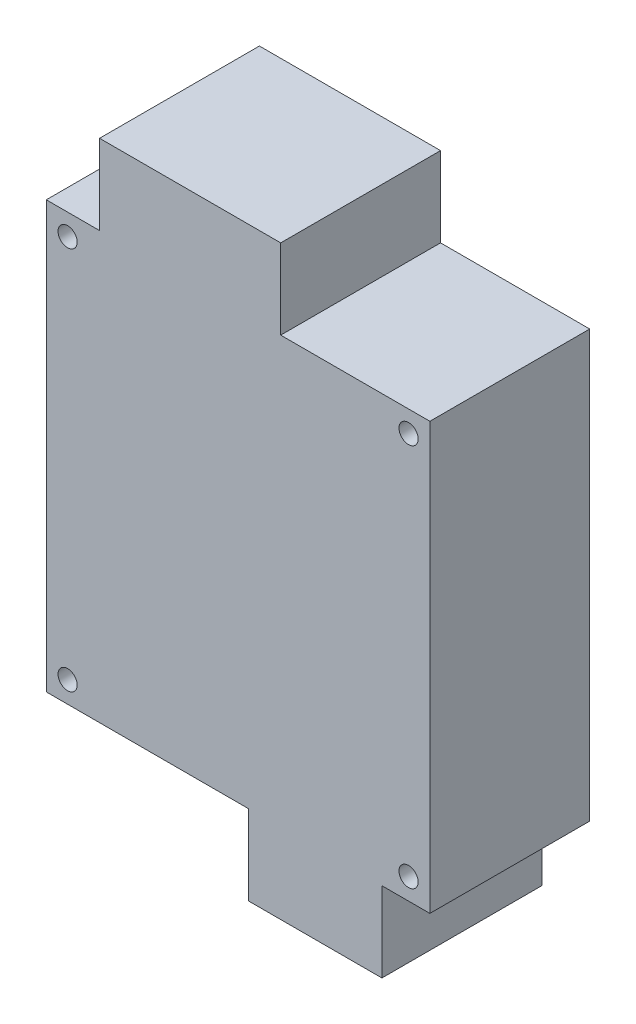
ISO-10303-21;
HEADER;
FILE_DESCRIPTION(('STEP AP214'),'2;1');
FILE_NAME('part.step','',(''),(''),'','','');
FILE_SCHEMA(('AUTOMOTIVE_DESIGN { 1 0 10303 214 1 1 1 1 }'));
ENDSEC;
DATA;
#1=APPLICATION_CONTEXT('core data for automotive mechanical design processes');
#2=APPLICATION_PROTOCOL_DEFINITION('international standard','automotive_design',2000,#1);
#3=PRODUCT_CONTEXT('',#1,'mechanical');
#4=PRODUCT('Part','Part','',(#3));
#5=PRODUCT_RELATED_PRODUCT_CATEGORY('part','',(#4));
#6=PRODUCT_DEFINITION_FORMATION('','',#4);
#7=PRODUCT_DEFINITION_CONTEXT('part definition',#1,'design');
#8=PRODUCT_DEFINITION('design','',#6,#7);
#9=PRODUCT_DEFINITION_SHAPE('','',#8);
#10=(LENGTH_UNIT() NAMED_UNIT(*) SI_UNIT(.MILLI.,.METRE.));
#11=(NAMED_UNIT(*) PLANE_ANGLE_UNIT() SI_UNIT($,.RADIAN.));
#12=(NAMED_UNIT(*) SI_UNIT($,.STERADIAN.) SOLID_ANGLE_UNIT());
#13=UNCERTAINTY_MEASURE_WITH_UNIT(LENGTH_MEASURE(1.E-05),#10,'distance_accuracy_value','');
#14=(GEOMETRIC_REPRESENTATION_CONTEXT(3) GLOBAL_UNCERTAINTY_ASSIGNED_CONTEXT((#13)) GLOBAL_UNIT_ASSIGNED_CONTEXT((#10,
#11,#12)) REPRESENTATION_CONTEXT('',''));
#15=CARTESIAN_POINT('',(0.,0.,0.));
#16=DIRECTION('',(0.,0.,1.));
#17=DIRECTION('',(1.,0.,0.));
#18=AXIS2_PLACEMENT_3D('',#15,#16,#17);
#19=CARTESIAN_POINT('',(0.,0.,30.));
#20=DIRECTION('',(1.,0.,0.));
#21=DIRECTION('',(0.,0.,-1.));
#22=AXIS2_PLACEMENT_3D('',#19,#20,#21);
#23=PLANE('',#22);
#24=DIRECTION('',(0.,-1.,0.));
#25=VECTOR('',#24,1.);
#26=CARTESIAN_POINT('',(0.,0.,0.));
#27=LINE('',#26,#25);
#28=CARTESIAN_POINT('',(0.,95.,0.));
#29=VERTEX_POINT('',#28);
#30=CARTESIAN_POINT('',(0.,15.,0.));
#31=VERTEX_POINT('',#30);
#32=EDGE_CURVE('E263',#29,#31,#27,.T.);
#33=ORIENTED_EDGE('',*,*,#32,.T.);
#34=DIRECTION('',(0.,0.,-1.));
#35=VECTOR('',#34,1.);
#36=CARTESIAN_POINT('',(0.,15.,70.853396431631));
#37=LINE('',#36,#35);
#38=CARTESIAN_POINT('',(0.,15.,30.));
#39=VERTEX_POINT('',#38);
#40=EDGE_CURVE('E197',#39,#31,#37,.T.);
#41=ORIENTED_EDGE('',*,*,#40,.F.);
#42=DIRECTION('',(0.,-1.,0.));
#43=VECTOR('',#42,1.);
#44=CARTESIAN_POINT('',(0.,0.,30.));
#45=LINE('',#44,#43);
#46=CARTESIAN_POINT('',(0.,95.,30.));
#47=VERTEX_POINT('',#46);
#48=EDGE_CURVE('E264',#47,#39,#45,.T.);
#49=ORIENTED_EDGE('',*,*,#48,.F.);
#50=DIRECTION('',(0.,0.,-1.));
#51=VECTOR('',#50,1.);
#52=CARTESIAN_POINT('',(0.,95.,70.853396431631));
#53=LINE('',#52,#51);
#54=EDGE_CURVE('E213',#47,#29,#53,.T.);
#55=ORIENTED_EDGE('',*,*,#54,.T.);
#56=EDGE_LOOP('',(#33,#41,#49,#55));
#57=FACE_BOUND('',#56,.T.);
#58=ADVANCED_FACE('F38',(#57),#23,.F.);
#59=CARTESIAN_POINT('',(0.,0.,30.));
#60=DIRECTION('',(0.,1.,0.));
#61=DIRECTION('',(0.,0.,1.));
#62=AXIS2_PLACEMENT_3D('',#59,#60,#61);
#63=PLANE('',#62);
#64=DIRECTION('',(1.,0.,0.));
#65=VECTOR('',#64,1.);
#66=CARTESIAN_POINT('',(0.,0.,0.));
#67=LINE('',#66,#65);
#68=CARTESIAN_POINT('',(38.,0.,0.));
#69=VERTEX_POINT('',#68);
#70=CARTESIAN_POINT('',(63.,0.,0.));
#71=VERTEX_POINT('',#70);
#72=EDGE_CURVE('E278',#69,#71,#67,.T.);
#73=ORIENTED_EDGE('',*,*,#72,.T.);
#74=DIRECTION('',(0.,0.,-1.));
#75=VECTOR('',#74,1.);
#76=CARTESIAN_POINT('',(63.,0.,61.7647603485372));
#77=LINE('',#76,#75);
#78=CARTESIAN_POINT('',(63.,0.,30.));
#79=VERTEX_POINT('',#78);
#80=EDGE_CURVE('E55',#79,#71,#77,.T.);
#81=ORIENTED_EDGE('',*,*,#80,.F.);
#82=DIRECTION('',(1.,0.,0.));
#83=VECTOR('',#82,1.);
#84=CARTESIAN_POINT('',(0.,0.,30.));
#85=LINE('',#84,#83);
#86=CARTESIAN_POINT('',(38.,0.,30.));
#87=VERTEX_POINT('',#86);
#88=EDGE_CURVE('E268',#87,#79,#85,.T.);
#89=ORIENTED_EDGE('',*,*,#88,.F.);
#90=DIRECTION('',(0.,0.,-1.));
#91=VECTOR('',#90,1.);
#92=CARTESIAN_POINT('',(38.,0.,70.853396431631));
#93=LINE('',#92,#91);
#94=EDGE_CURVE('E188',#87,#69,#93,.T.);
#95=ORIENTED_EDGE('',*,*,#94,.T.);
#96=EDGE_LOOP('',(#73,#81,#89,#95));
#97=FACE_BOUND('',#96,.T.);
#98=ADVANCED_FACE('F328',(#97),#63,.F.);
#99=CARTESIAN_POINT('',(72.,0.,30.));
#100=DIRECTION('',(-1.,0.,0.));
#101=DIRECTION('',(0.,0.,1.));
#102=AXIS2_PLACEMENT_3D('',#99,#100,#101);
#103=PLANE('',#102);
#104=DIRECTION('',(0.,1.,0.));
#105=VECTOR('',#104,1.);
#106=CARTESIAN_POINT('',(72.,0.,0.));
#107=LINE('',#106,#105);
#108=CARTESIAN_POINT('',(72.,15.,0.));
#109=VERTEX_POINT('',#108);
#110=CARTESIAN_POINT('',(72.,95.,0.));
#111=VERTEX_POINT('',#110);
#112=EDGE_CURVE('E281',#109,#111,#107,.T.);
#113=ORIENTED_EDGE('',*,*,#112,.T.);
#114=DIRECTION('',(0.,0.,-1.));
#115=VECTOR('',#114,1.);
#116=CARTESIAN_POINT('',(72.,95.,61.7647603485372));
#117=LINE('',#116,#115);
#118=CARTESIAN_POINT('',(72.,95.,30.));
#119=VERTEX_POINT('',#118);
#120=EDGE_CURVE('E63',#119,#111,#117,.T.);
#121=ORIENTED_EDGE('',*,*,#120,.F.);
#122=DIRECTION('',(0.,1.,0.));
#123=VECTOR('',#122,1.);
#124=CARTESIAN_POINT('',(72.,0.,30.));
#125=LINE('',#124,#123);
#126=CARTESIAN_POINT('',(72.,15.,30.));
#127=VERTEX_POINT('',#126);
#128=EDGE_CURVE('E47',#127,#119,#125,.T.);
#129=ORIENTED_EDGE('',*,*,#128,.F.);
#130=DIRECTION('',(0.,0.,-1.));
#131=VECTOR('',#130,1.);
#132=CARTESIAN_POINT('',(72.,15.,61.7647603485372));
#133=LINE('',#132,#131);
#134=EDGE_CURVE('E167',#127,#109,#133,.T.);
#135=ORIENTED_EDGE('',*,*,#134,.T.);
#136=EDGE_LOOP('',(#113,#121,#129,#135));
#137=FACE_BOUND('',#136,.T.);
#138=ADVANCED_FACE('F309',(#137),#103,.F.);
#139=CARTESIAN_POINT('',(0.,110.,30.));
#140=DIRECTION('',(0.,-1.,0.));
#141=DIRECTION('',(0.,0.,-1.));
#142=AXIS2_PLACEMENT_3D('',#139,#140,#141);
#143=PLANE('',#142);
#144=DIRECTION('',(-1.,0.,0.));
#145=VECTOR('',#144,1.);
#146=CARTESIAN_POINT('',(0.,110.,30.));
#147=LINE('',#146,#145);
#148=CARTESIAN_POINT('',(44.,110.,30.));
#149=VERTEX_POINT('',#148);
#150=CARTESIAN_POINT('',(10.,110.,30.));
#151=VERTEX_POINT('',#150);
#152=EDGE_CURVE('E11',#149,#151,#147,.T.);
#153=ORIENTED_EDGE('',*,*,#152,.F.);
#154=DIRECTION('',(0.,0.,-1.));
#155=VECTOR('',#154,1.);
#156=CARTESIAN_POINT('',(44.,110.,61.7647603485372));
#157=LINE('',#156,#155);
#158=CARTESIAN_POINT('',(44.,110.,0.));
#159=VERTEX_POINT('',#158);
#160=EDGE_CURVE('E138',#149,#159,#157,.T.);
#161=ORIENTED_EDGE('',*,*,#160,.T.);
#162=DIRECTION('',(-1.,0.,0.));
#163=VECTOR('',#162,1.);
#164=CARTESIAN_POINT('',(0.,110.,0.));
#165=LINE('',#164,#163);
#166=CARTESIAN_POINT('',(10.,110.,0.));
#167=VERTEX_POINT('',#166);
#168=EDGE_CURVE('E41',#159,#167,#165,.T.);
#169=ORIENTED_EDGE('',*,*,#168,.T.);
#170=DIRECTION('',(0.,0.,-1.));
#171=VECTOR('',#170,1.);
#172=CARTESIAN_POINT('',(10.,110.,70.853396431631));
#173=LINE('',#172,#171);
#174=EDGE_CURVE('E222',#151,#167,#173,.T.);
#175=ORIENTED_EDGE('',*,*,#174,.F.);
#176=EDGE_LOOP('',(#153,#161,#169,#175));
#177=FACE_BOUND('',#176,.T.);
#178=ADVANCED_FACE('F288',(#177),#143,.F.);
#179=CARTESIAN_POINT('',(0.,0.,30.));
#180=DIRECTION('',(0.,0.,-1.));
#181=DIRECTION('',(-1.,0.,0.));
#182=AXIS2_PLACEMENT_3D('',#179,#180,#181);
#183=PLANE('',#182);
#184=CARTESIAN_POINT('',(4.,91.,30.));
#185=DIRECTION('',(0.,0.,1.));
#186=DIRECTION('',(1.,0.,0.));
#187=AXIS2_PLACEMENT_3D('',#184,#185,#186);
#188=CIRCLE('',#187,1.8);
#189=CARTESIAN_POINT('',(5.8,91.,30.));
#190=VERTEX_POINT('',#189);
#191=EDGE_CURVE('E208',#190,#190,#188,.T.);
#192=ORIENTED_EDGE('',*,*,#191,.F.);
#193=EDGE_LOOP('',(#192));
#194=FACE_BOUND('',#193,.T.);
#195=CARTESIAN_POINT('',(68.,91.,30.));
#196=DIRECTION('',(0.,0.,1.));
#197=DIRECTION('',(1.,0.,0.));
#198=AXIS2_PLACEMENT_3D('',#195,#196,#197);
#199=CIRCLE('',#198,1.8);
#200=CARTESIAN_POINT('',(69.8,91.,30.));
#201=VERTEX_POINT('',#200);
#202=EDGE_CURVE('E239',#201,#201,#199,.T.);
#203=ORIENTED_EDGE('',*,*,#202,.F.);
#204=EDGE_LOOP('',(#203));
#205=FACE_BOUND('',#204,.T.);
#206=CARTESIAN_POINT('',(4.,19.,30.));
#207=DIRECTION('',(0.,0.,1.));
#208=DIRECTION('',(1.,0.,0.));
#209=AXIS2_PLACEMENT_3D('',#206,#207,#208);
#210=CIRCLE('',#209,1.8);
#211=CARTESIAN_POINT('',(5.8,19.,30.));
#212=VERTEX_POINT('',#211);
#213=EDGE_CURVE('E247',#212,#212,#210,.T.);
#214=ORIENTED_EDGE('',*,*,#213,.F.);
#215=EDGE_LOOP('',(#214));
#216=FACE_BOUND('',#215,.T.);
#217=CARTESIAN_POINT('',(68.,19.,30.));
#218=DIRECTION('',(0.,0.,1.));
#219=DIRECTION('',(1.,0.,0.));
#220=AXIS2_PLACEMENT_3D('',#217,#218,#219);
#221=CIRCLE('',#220,1.8);
#222=CARTESIAN_POINT('',(69.8,19.,30.));
#223=VERTEX_POINT('',#222);
#224=EDGE_CURVE('E255',#223,#223,#221,.T.);
#225=ORIENTED_EDGE('',*,*,#224,.F.);
#226=EDGE_LOOP('',(#225));
#227=FACE_BOUND('',#226,.T.);
#228=DIRECTION('',(1.,0.,0.));
#229=VECTOR('',#228,1.);
#230=CARTESIAN_POINT('',(72.,95.,30.));
#231=LINE('',#230,#229);
#232=CARTESIAN_POINT('',(44.,95.,30.));
#233=VERTEX_POINT('',#232);
#234=EDGE_CURVE('E160',#233,#119,#231,.T.);
#235=ORIENTED_EDGE('',*,*,#234,.F.);
#236=DIRECTION('',(0.,-1.,0.));
#237=VECTOR('',#236,1.);
#238=CARTESIAN_POINT('',(44.,110.,30.));
#239=LINE('',#238,#237);
#240=EDGE_CURVE('E135',#149,#233,#239,.T.);
#241=ORIENTED_EDGE('',*,*,#240,.F.);
#242=ORIENTED_EDGE('',*,*,#152,.T.);
#243=DIRECTION('',(0.,1.,0.));
#244=VECTOR('',#243,1.);
#245=CARTESIAN_POINT('',(10.,110.,30.));
#246=LINE('',#245,#244);
#247=CARTESIAN_POINT('',(10.,95.,30.));
#248=VERTEX_POINT('',#247);
#249=EDGE_CURVE('E209',#248,#151,#246,.T.);
#250=ORIENTED_EDGE('',*,*,#249,.F.);
#251=DIRECTION('',(1.,0.,0.));
#252=VECTOR('',#251,1.);
#253=CARTESIAN_POINT('',(0.,95.,30.));
#254=LINE('',#253,#252);
#255=EDGE_CURVE('E194',#47,#248,#254,.T.);
#256=ORIENTED_EDGE('',*,*,#255,.F.);
#257=ORIENTED_EDGE('',*,*,#48,.T.);
#258=DIRECTION('',(-1.,0.,0.));
#259=VECTOR('',#258,1.);
#260=CARTESIAN_POINT('',(0.,15.,30.));
#261=LINE('',#260,#259);
#262=CARTESIAN_POINT('',(38.,15.,30.));
#263=VERTEX_POINT('',#262);
#264=EDGE_CURVE('E187',#263,#39,#261,.T.);
#265=ORIENTED_EDGE('',*,*,#264,.F.);
#266=DIRECTION('',(0.,1.,0.));
#267=VECTOR('',#266,1.);
#268=CARTESIAN_POINT('',(38.,0.,30.));
#269=LINE('',#268,#267);
#270=EDGE_CURVE('E184',#87,#263,#269,.T.);
#271=ORIENTED_EDGE('',*,*,#270,.F.);
#272=ORIENTED_EDGE('',*,*,#88,.T.);
#273=DIRECTION('',(0.,-1.,0.));
#274=VECTOR('',#273,1.);
#275=CARTESIAN_POINT('',(63.,0.,30.));
#276=LINE('',#275,#274);
#277=CARTESIAN_POINT('',(63.,15.,30.));
#278=VERTEX_POINT('',#277);
#279=EDGE_CURVE('E164',#278,#79,#276,.T.);
#280=ORIENTED_EDGE('',*,*,#279,.F.);
#281=DIRECTION('',(-1.,0.,0.));
#282=VECTOR('',#281,1.);
#283=CARTESIAN_POINT('',(72.,15.,30.));
#284=LINE('',#283,#282);
#285=EDGE_CURVE('E146',#127,#278,#284,.T.);
#286=ORIENTED_EDGE('',*,*,#285,.F.);
#287=ORIENTED_EDGE('',*,*,#128,.T.);
#288=EDGE_LOOP('',(#235,#241,#242,#250,#256,#257,#265,#271,#272,#280,#286,#287));
#289=FACE_BOUND('',#288,.T.);
#290=ADVANCED_FACE('F304',(#194,#205,#216,#227,#289),#183,.F.);
#291=CARTESIAN_POINT('',(0.,0.,0.));
#292=DIRECTION('',(0.,0.,-1.));
#293=DIRECTION('',(-1.,0.,0.));
#294=AXIS2_PLACEMENT_3D('',#291,#292,#293);
#295=PLANE('',#294);
#296=DIRECTION('',(0.,1.,0.));
#297=VECTOR('',#296,1.);
#298=CARTESIAN_POINT('',(44.,110.,0.));
#299=LINE('',#298,#297);
#300=CARTESIAN_POINT('',(44.,95.,0.));
#301=VERTEX_POINT('',#300);
#302=EDGE_CURVE('E132',#301,#159,#299,.T.);
#303=ORIENTED_EDGE('',*,*,#302,.F.);
#304=DIRECTION('',(-1.,0.,0.));
#305=VECTOR('',#304,1.);
#306=CARTESIAN_POINT('',(72.,95.,0.));
#307=LINE('',#306,#305);
#308=EDGE_CURVE('E140',#111,#301,#307,.T.);
#309=ORIENTED_EDGE('',*,*,#308,.F.);
#310=ORIENTED_EDGE('',*,*,#112,.F.);
#311=DIRECTION('',(1.,0.,0.));
#312=VECTOR('',#311,1.);
#313=CARTESIAN_POINT('',(72.,15.,0.));
#314=LINE('',#313,#312);
#315=CARTESIAN_POINT('',(63.,15.,0.));
#316=VERTEX_POINT('',#315);
#317=EDGE_CURVE('E173',#316,#109,#314,.T.);
#318=ORIENTED_EDGE('',*,*,#317,.F.);
#319=DIRECTION('',(0.,1.,0.));
#320=VECTOR('',#319,1.);
#321=CARTESIAN_POINT('',(63.,0.,0.));
#322=LINE('',#321,#320);
#323=EDGE_CURVE('E170',#71,#316,#322,.T.);
#324=ORIENTED_EDGE('',*,*,#323,.F.);
#325=ORIENTED_EDGE('',*,*,#72,.F.);
#326=DIRECTION('',(0.,-1.,0.));
#327=VECTOR('',#326,1.);
#328=CARTESIAN_POINT('',(38.,0.,0.));
#329=LINE('',#328,#327);
#330=CARTESIAN_POINT('',(38.,15.,0.));
#331=VERTEX_POINT('',#330);
#332=EDGE_CURVE('E193',#331,#69,#329,.T.);
#333=ORIENTED_EDGE('',*,*,#332,.F.);
#334=DIRECTION('',(1.,0.,0.));
#335=VECTOR('',#334,1.);
#336=CARTESIAN_POINT('',(0.,15.,0.));
#337=LINE('',#336,#335);
#338=EDGE_CURVE('E189',#31,#331,#337,.T.);
#339=ORIENTED_EDGE('',*,*,#338,.F.);
#340=ORIENTED_EDGE('',*,*,#32,.F.);
#341=DIRECTION('',(-1.,0.,0.));
#342=VECTOR('',#341,1.);
#343=CARTESIAN_POINT('',(0.,95.,0.));
#344=LINE('',#343,#342);
#345=CARTESIAN_POINT('',(10.,95.,0.));
#346=VERTEX_POINT('',#345);
#347=EDGE_CURVE('E219',#346,#29,#344,.T.);
#348=ORIENTED_EDGE('',*,*,#347,.F.);
#349=DIRECTION('',(0.,-1.,0.));
#350=VECTOR('',#349,1.);
#351=CARTESIAN_POINT('',(10.,110.,0.));
#352=LINE('',#351,#350);
#353=EDGE_CURVE('E163',#167,#346,#352,.T.);
#354=ORIENTED_EDGE('',*,*,#353,.F.);
#355=ORIENTED_EDGE('',*,*,#168,.F.);
#356=EDGE_LOOP('',(#303,#309,#310,#318,#324,#325,#333,#339,#340,#348,#354,#355));
#357=FACE_BOUND('',#356,.T.);
#358=CARTESIAN_POINT('',(4.,91.,0.));
#359=DIRECTION('',(0.,0.,1.));
#360=DIRECTION('',(1.,0.,0.));
#361=AXIS2_PLACEMENT_3D('',#358,#359,#360);
#362=CIRCLE('',#361,1.8);
#363=CARTESIAN_POINT('',(5.8,91.,0.));
#364=VERTEX_POINT('',#363);
#365=EDGE_CURVE('E235',#364,#364,#362,.T.);
#366=ORIENTED_EDGE('',*,*,#365,.T.);
#367=EDGE_LOOP('',(#366));
#368=FACE_BOUND('',#367,.T.);
#369=CARTESIAN_POINT('',(68.,91.,0.));
#370=DIRECTION('',(0.,0.,1.));
#371=DIRECTION('',(1.,0.,0.));
#372=AXIS2_PLACEMENT_3D('',#369,#370,#371);
#373=CIRCLE('',#372,1.8);
#374=CARTESIAN_POINT('',(69.8,91.,0.));
#375=VERTEX_POINT('',#374);
#376=EDGE_CURVE('E243',#375,#375,#373,.T.);
#377=ORIENTED_EDGE('',*,*,#376,.T.);
#378=EDGE_LOOP('',(#377));
#379=FACE_BOUND('',#378,.T.);
#380=CARTESIAN_POINT('',(4.,19.,0.));
#381=DIRECTION('',(0.,0.,1.));
#382=DIRECTION('',(1.,0.,0.));
#383=AXIS2_PLACEMENT_3D('',#380,#381,#382);
#384=CIRCLE('',#383,1.8);
#385=CARTESIAN_POINT('',(5.8,19.,0.));
#386=VERTEX_POINT('',#385);
#387=EDGE_CURVE('E251',#386,#386,#384,.T.);
#388=ORIENTED_EDGE('',*,*,#387,.T.);
#389=EDGE_LOOP('',(#388));
#390=FACE_BOUND('',#389,.T.);
#391=CARTESIAN_POINT('',(68.,19.,0.));
#392=DIRECTION('',(0.,0.,1.));
#393=DIRECTION('',(1.,0.,0.));
#394=AXIS2_PLACEMENT_3D('',#391,#392,#393);
#395=CIRCLE('',#394,1.8);
#396=CARTESIAN_POINT('',(69.8,19.,0.));
#397=VERTEX_POINT('',#396);
#398=EDGE_CURVE('E259',#397,#397,#395,.T.);
#399=ORIENTED_EDGE('',*,*,#398,.T.);
#400=EDGE_LOOP('',(#399));
#401=FACE_BOUND('',#400,.T.);
#402=ADVANCED_FACE('F149',(#357,#368,#379,#390,#401),#295,.T.);
#403=CARTESIAN_POINT('',(68.,19.,30.));
#404=DIRECTION('',(0.,0.,1.));
#405=DIRECTION('',(1.,0.,0.));
#406=AXIS2_PLACEMENT_3D('',#403,#404,#405);
#407=CYLINDRICAL_SURFACE('',#406,1.8);
#408=ORIENTED_EDGE('',*,*,#398,.F.);
#409=EDGE_LOOP('',(#408));
#410=FACE_BOUND('',#409,.T.);
#411=ORIENTED_EDGE('',*,*,#224,.T.);
#412=EDGE_LOOP('',(#411));
#413=FACE_BOUND('',#412,.T.);
#414=ADVANCED_FACE('F345',(#410,#413),#407,.F.);
#415=CARTESIAN_POINT('',(4.,19.,30.));
#416=DIRECTION('',(0.,0.,1.));
#417=DIRECTION('',(1.,0.,0.));
#418=AXIS2_PLACEMENT_3D('',#415,#416,#417);
#419=CYLINDRICAL_SURFACE('',#418,1.8);
#420=ORIENTED_EDGE('',*,*,#387,.F.);
#421=EDGE_LOOP('',(#420));
#422=FACE_BOUND('',#421,.T.);
#423=ORIENTED_EDGE('',*,*,#213,.T.);
#424=EDGE_LOOP('',(#423));
#425=FACE_BOUND('',#424,.T.);
#426=ADVANCED_FACE('F351',(#422,#425),#419,.F.);
#427=CARTESIAN_POINT('',(68.,91.,30.));
#428=DIRECTION('',(0.,0.,1.));
#429=DIRECTION('',(1.,0.,0.));
#430=AXIS2_PLACEMENT_3D('',#427,#428,#429);
#431=CYLINDRICAL_SURFACE('',#430,1.8);
#432=ORIENTED_EDGE('',*,*,#376,.F.);
#433=EDGE_LOOP('',(#432));
#434=FACE_BOUND('',#433,.T.);
#435=ORIENTED_EDGE('',*,*,#202,.T.);
#436=EDGE_LOOP('',(#435));
#437=FACE_BOUND('',#436,.T.);
#438=ADVANCED_FACE('F355',(#434,#437),#431,.F.);
#439=CARTESIAN_POINT('',(4.,91.,30.));
#440=DIRECTION('',(0.,0.,1.));
#441=DIRECTION('',(1.,0.,0.));
#442=AXIS2_PLACEMENT_3D('',#439,#440,#441);
#443=CYLINDRICAL_SURFACE('',#442,1.8);
#444=ORIENTED_EDGE('',*,*,#365,.F.);
#445=EDGE_LOOP('',(#444));
#446=FACE_BOUND('',#445,.T.);
#447=ORIENTED_EDGE('',*,*,#191,.T.);
#448=EDGE_LOOP('',(#447));
#449=FACE_BOUND('',#448,.T.);
#450=ADVANCED_FACE('F359',(#446,#449),#443,.F.);
#451=CARTESIAN_POINT('',(0.,95.,70.853396431631));
#452=DIRECTION('',(0.,-1.,0.));
#453=DIRECTION('',(0.,0.,-1.));
#454=AXIS2_PLACEMENT_3D('',#451,#452,#453);
#455=PLANE('',#454);
#456=ORIENTED_EDGE('',*,*,#255,.T.);
#457=DIRECTION('',(0.,0.,-1.));
#458=VECTOR('',#457,1.);
#459=CARTESIAN_POINT('',(10.,95.,70.853396431631));
#460=LINE('',#459,#458);
#461=EDGE_CURVE('E226',#248,#346,#460,.T.);
#462=ORIENTED_EDGE('',*,*,#461,.T.);
#463=ORIENTED_EDGE('',*,*,#347,.T.);
#464=ORIENTED_EDGE('',*,*,#54,.F.);
#465=EDGE_LOOP('',(#456,#462,#463,#464));
#466=FACE_BOUND('',#465,.T.);
#467=ADVANCED_FACE('F297',(#466),#455,.F.);
#468=CARTESIAN_POINT('',(10.,110.,70.853396431631));
#469=DIRECTION('',(1.,0.,0.));
#470=DIRECTION('',(0.,0.,-1.));
#471=AXIS2_PLACEMENT_3D('',#468,#469,#470);
#472=PLANE('',#471);
#473=ORIENTED_EDGE('',*,*,#249,.T.);
#474=ORIENTED_EDGE('',*,*,#174,.T.);
#475=ORIENTED_EDGE('',*,*,#353,.T.);
#476=ORIENTED_EDGE('',*,*,#461,.F.);
#477=EDGE_LOOP('',(#473,#474,#475,#476));
#478=FACE_BOUND('',#477,.T.);
#479=ADVANCED_FACE('F290',(#478),#472,.F.);
#480=CARTESIAN_POINT('',(38.,0.,70.853396431631));
#481=DIRECTION('',(1.,0.,0.));
#482=DIRECTION('',(0.,0.,-1.));
#483=AXIS2_PLACEMENT_3D('',#480,#481,#482);
#484=PLANE('',#483);
#485=ORIENTED_EDGE('',*,*,#270,.T.);
#486=DIRECTION('',(0.,0.,-1.));
#487=VECTOR('',#486,1.);
#488=CARTESIAN_POINT('',(38.,15.,70.853396431631));
#489=LINE('',#488,#487);
#490=EDGE_CURVE('E201',#263,#331,#489,.T.);
#491=ORIENTED_EDGE('',*,*,#490,.T.);
#492=ORIENTED_EDGE('',*,*,#332,.T.);
#493=ORIENTED_EDGE('',*,*,#94,.F.);
#494=EDGE_LOOP('',(#485,#491,#492,#493));
#495=FACE_BOUND('',#494,.T.);
#496=ADVANCED_FACE('F366',(#495),#484,.F.);
#497=CARTESIAN_POINT('',(0.,15.,70.853396431631));
#498=DIRECTION('',(0.,1.,0.));
#499=DIRECTION('',(-1.,0.,0.));
#500=AXIS2_PLACEMENT_3D('',#497,#498,#499);
#501=PLANE('',#500);
#502=ORIENTED_EDGE('',*,*,#264,.T.);
#503=ORIENTED_EDGE('',*,*,#40,.T.);
#504=ORIENTED_EDGE('',*,*,#338,.T.);
#505=ORIENTED_EDGE('',*,*,#490,.F.);
#506=EDGE_LOOP('',(#502,#503,#504,#505));
#507=FACE_BOUND('',#506,.T.);
#508=ADVANCED_FACE('F324',(#507),#501,.F.);
#509=CARTESIAN_POINT('',(72.,15.,61.7647603485372));
#510=DIRECTION('',(0.,1.,0.));
#511=DIRECTION('',(0.,0.,1.));
#512=AXIS2_PLACEMENT_3D('',#509,#510,#511);
#513=PLANE('',#512);
#514=ORIENTED_EDGE('',*,*,#285,.T.);
#515=DIRECTION('',(0.,0.,-1.));
#516=VECTOR('',#515,1.);
#517=CARTESIAN_POINT('',(63.,15.,61.7647603485372));
#518=LINE('',#517,#516);
#519=EDGE_CURVE('E179',#278,#316,#518,.T.);
#520=ORIENTED_EDGE('',*,*,#519,.T.);
#521=ORIENTED_EDGE('',*,*,#317,.T.);
#522=ORIENTED_EDGE('',*,*,#134,.F.);
#523=EDGE_LOOP('',(#514,#520,#521,#522));
#524=FACE_BOUND('',#523,.T.);
#525=ADVANCED_FACE('F313',(#524),#513,.F.);
#526=CARTESIAN_POINT('',(63.,0.,61.7647603485372));
#527=DIRECTION('',(-1.,0.,0.));
#528=DIRECTION('',(0.,0.,1.));
#529=AXIS2_PLACEMENT_3D('',#526,#527,#528);
#530=PLANE('',#529);
#531=ORIENTED_EDGE('',*,*,#279,.T.);
#532=ORIENTED_EDGE('',*,*,#80,.T.);
#533=ORIENTED_EDGE('',*,*,#323,.T.);
#534=ORIENTED_EDGE('',*,*,#519,.F.);
#535=EDGE_LOOP('',(#531,#532,#533,#534));
#536=FACE_BOUND('',#535,.T.);
#537=ADVANCED_FACE('F316',(#536),#530,.F.);
#538=CARTESIAN_POINT('',(44.,110.,61.7647603485372));
#539=DIRECTION('',(-1.,0.,0.));
#540=DIRECTION('',(0.,0.,1.));
#541=AXIS2_PLACEMENT_3D('',#538,#539,#540);
#542=PLANE('',#541);
#543=ORIENTED_EDGE('',*,*,#240,.T.);
#544=DIRECTION('',(0.,0.,-1.));
#545=VECTOR('',#544,1.);
#546=CARTESIAN_POINT('',(44.,95.,61.7647603485372));
#547=LINE('',#546,#545);
#548=EDGE_CURVE('E129',#233,#301,#547,.T.);
#549=ORIENTED_EDGE('',*,*,#548,.T.);
#550=ORIENTED_EDGE('',*,*,#302,.T.);
#551=ORIENTED_EDGE('',*,*,#160,.F.);
#552=EDGE_LOOP('',(#543,#549,#550,#551));
#553=FACE_BOUND('',#552,.T.);
#554=ADVANCED_FACE('F130',(#553),#542,.F.);
#555=CARTESIAN_POINT('',(72.,95.,61.7647603485372));
#556=DIRECTION('',(0.,-1.,0.));
#557=DIRECTION('',(0.,0.,-1.));
#558=AXIS2_PLACEMENT_3D('',#555,#556,#557);
#559=PLANE('',#558);
#560=ORIENTED_EDGE('',*,*,#234,.T.);
#561=ORIENTED_EDGE('',*,*,#120,.T.);
#562=ORIENTED_EDGE('',*,*,#308,.T.);
#563=ORIENTED_EDGE('',*,*,#548,.F.);
#564=EDGE_LOOP('',(#560,#561,#562,#563));
#565=FACE_BOUND('',#564,.T.);
#566=ADVANCED_FACE('F141',(#565),#559,.F.);
#567=CLOSED_SHELL('',(#58,#98,#138,#178,#290,#402,#414,#426,#438,#450,#467,#479,#496,#508,#525,
#537,#554,#566));
#568=MANIFOLD_SOLID_BREP('B2',#567);
#569=ADVANCED_BREP_SHAPE_REPRESENTATION('',(#18,#568),#14);
#570=SHAPE_DEFINITION_REPRESENTATION(#9,#569);
ENDSEC;
END-ISO-10303-21;
